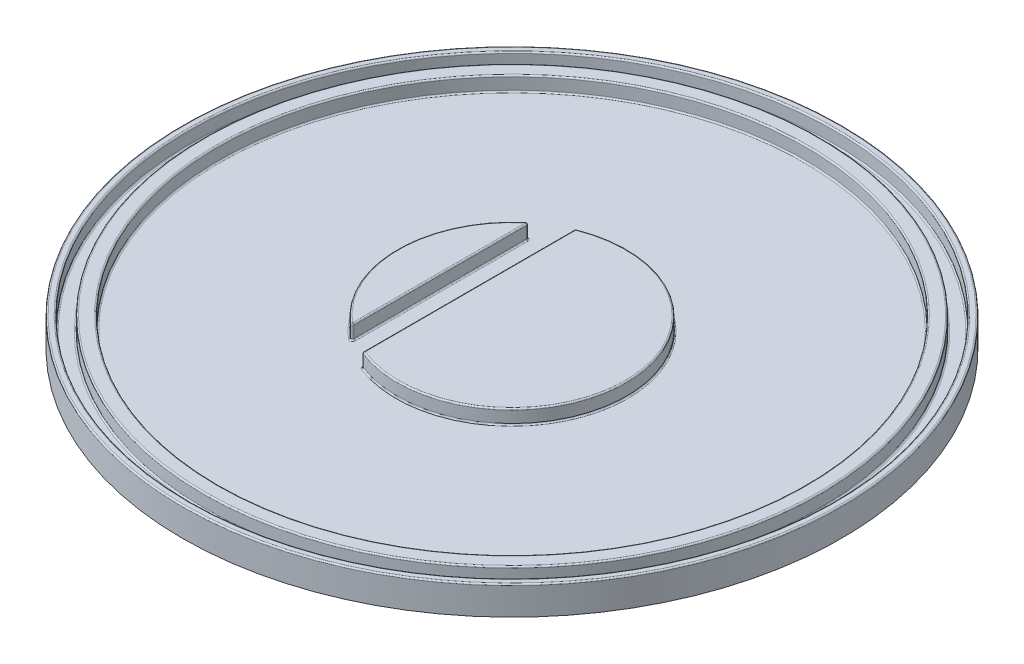
ISO-10303-21;
HEADER;
FILE_DESCRIPTION(('STEP AP214'),'2;1');
FILE_NAME('part.step','',(''),(''),'','','');
FILE_SCHEMA(('AUTOMOTIVE_DESIGN { 1 0 10303 214 1 1 1 1 }'));
ENDSEC;
DATA;
#1=APPLICATION_CONTEXT('core data for automotive mechanical design processes');
#2=APPLICATION_PROTOCOL_DEFINITION('international standard','automotive_design',2000,#1);
#3=PRODUCT_CONTEXT('',#1,'mechanical');
#4=PRODUCT('Part','Part','',(#3));
#5=PRODUCT_RELATED_PRODUCT_CATEGORY('part','',(#4));
#6=PRODUCT_DEFINITION_FORMATION('','',#4);
#7=PRODUCT_DEFINITION_CONTEXT('part definition',#1,'design');
#8=PRODUCT_DEFINITION('design','',#6,#7);
#9=PRODUCT_DEFINITION_SHAPE('','',#8);
#10=(LENGTH_UNIT() NAMED_UNIT(*) SI_UNIT(.MILLI.,.METRE.));
#11=(NAMED_UNIT(*) PLANE_ANGLE_UNIT() SI_UNIT($,.RADIAN.));
#12=(NAMED_UNIT(*) SI_UNIT($,.STERADIAN.) SOLID_ANGLE_UNIT());
#13=UNCERTAINTY_MEASURE_WITH_UNIT(LENGTH_MEASURE(1.E-05),#10,'distance_accuracy_value','');
#14=(GEOMETRIC_REPRESENTATION_CONTEXT(3) GLOBAL_UNCERTAINTY_ASSIGNED_CONTEXT((#13)) GLOBAL_UNIT_ASSIGNED_CONTEXT((#10,
#11,#12)) REPRESENTATION_CONTEXT('',''));
#15=CARTESIAN_POINT('',(0.,0.,0.));
#16=DIRECTION('',(0.,0.,1.));
#17=DIRECTION('',(1.,0.,0.));
#18=AXIS2_PLACEMENT_3D('',#15,#16,#17);
#19=CARTESIAN_POINT('',(0.,2.,0.));
#20=DIRECTION('',(0.,1.,0.));
#21=DIRECTION('',(0.,0.,1.));
#22=AXIS2_PLACEMENT_3D('',#19,#20,#21);
#23=PLANE('',#22);
#24=DIRECTION('',(0.,0.,-1.));
#25=VECTOR('',#24,1.);
#26=CARTESIAN_POINT('',(-2.9,2.,7.41619848709566));
#27=LINE('',#26,#25);
#28=CARTESIAN_POINT('',(-2.9,2.,-7.34846922834954));
#29=VERTEX_POINT('',#28);
#30=CARTESIAN_POINT('',(-2.9,2.,7.34846922834954));
#31=VERTEX_POINT('',#30);
#32=EDGE_CURVE('E211',#29,#31,#27,.F.);
#33=ORIENTED_EDGE('',*,*,#32,.T.);
#34=CARTESIAN_POINT('',(0.,2.,0.));
#35=DIRECTION('',(0.,1.,0.));
#36=DIRECTION('',(0.,0.,1.));
#37=AXIS2_PLACEMENT_3D('',#34,#35,#36);
#38=CIRCLE('',#37,7.9);
#39=EDGE_CURVE('E213',#31,#29,#38,.T.);
#40=ORIENTED_EDGE('',*,*,#39,.T.);
#41=EDGE_LOOP('',(#33,#40));
#42=FACE_BOUND('',#41,.T.);
#43=ADVANCED_FACE('F40',(#42),#23,.T.);
#44=CARTESIAN_POINT('',(0.,2.,0.));
#45=DIRECTION('',(0.,-1.,0.));
#46=DIRECTION('',(0.,0.,-1.));
#47=AXIS2_PLACEMENT_3D('',#44,#45,#46);
#48=CYLINDRICAL_SURFACE('',#47,8.);
#49=DIRECTION('',(0.,-1.,0.));
#50=VECTOR('',#49,1.);
#51=CARTESIAN_POINT('',(-2.93670886075949,2.,-7.44148782617675));
#52=LINE('',#51,#50);
#53=CARTESIAN_POINT('',(-2.93670886075949,1.1,-7.44148782617674));
#54=VERTEX_POINT('',#53);
#55=CARTESIAN_POINT('',(-2.93670886075949,1.9,-7.44148782617674));
#56=VERTEX_POINT('',#55);
#57=EDGE_CURVE('E154',#54,#56,#52,.F.);
#58=ORIENTED_EDGE('',*,*,#57,.T.);
#59=CARTESIAN_POINT('',(0.,1.9,0.));
#60=DIRECTION('',(0.,1.,0.));
#61=DIRECTION('',(0.,0.,1.));
#62=AXIS2_PLACEMENT_3D('',#59,#60,#61);
#63=CIRCLE('',#62,8.);
#64=CARTESIAN_POINT('',(-2.93670886075949,1.9,7.44148782617674));
#65=VERTEX_POINT('',#64);
#66=EDGE_CURVE('E150',#56,#65,#63,.F.);
#67=ORIENTED_EDGE('',*,*,#66,.T.);
#68=DIRECTION('',(0.,-1.,0.));
#69=VECTOR('',#68,1.);
#70=CARTESIAN_POINT('',(-2.93670886075949,2.,7.44148782617675));
#71=LINE('',#70,#69);
#72=CARTESIAN_POINT('',(-2.93670886075949,1.1,7.44148782617674));
#73=VERTEX_POINT('',#72);
#74=EDGE_CURVE('E143',#65,#73,#71,.T.);
#75=ORIENTED_EDGE('',*,*,#74,.T.);
#76=CARTESIAN_POINT('',(0.,1.1,0.));
#77=DIRECTION('',(0.,1.,0.));
#78=DIRECTION('',(0.,0.,1.));
#79=AXIS2_PLACEMENT_3D('',#76,#77,#78);
#80=CIRCLE('',#79,8.);
#81=EDGE_CURVE('E147',#73,#54,#80,.T.);
#82=ORIENTED_EDGE('',*,*,#81,.T.);
#83=EDGE_LOOP('',(#58,#67,#75,#82));
#84=FACE_BOUND('',#83,.T.);
#85=ADVANCED_FACE('F146',(#84),#48,.T.);
#86=CARTESIAN_POINT('',(0.,1.,0.));
#87=DIRECTION('',(0.,-1.,0.));
#88=DIRECTION('',(0.,0.,-1.));
#89=AXIS2_PLACEMENT_3D('',#86,#87,#88);
#90=CYLINDRICAL_SURFACE('',#89,23.);
#91=CARTESIAN_POINT('',(0.,1.9,0.));
#92=DIRECTION('',(0.,1.,0.));
#93=DIRECTION('',(0.,0.,1.));
#94=AXIS2_PLACEMENT_3D('',#91,#92,#93);
#95=CIRCLE('',#94,23.);
#96=CARTESIAN_POINT('',(0.,1.9,23.));
#97=VERTEX_POINT('',#96);
#98=EDGE_CURVE('E268',#97,#97,#95,.F.);
#99=ORIENTED_EDGE('',*,*,#98,.T.);
#100=EDGE_LOOP('',(#99));
#101=FACE_BOUND('',#100,.T.);
#102=CARTESIAN_POINT('',(0.,0.,0.));
#103=DIRECTION('',(0.,1.,0.));
#104=DIRECTION('',(0.,0.,1.));
#105=AXIS2_PLACEMENT_3D('',#102,#103,#104);
#106=CIRCLE('',#105,23.);
#107=CARTESIAN_POINT('',(0.,0.,23.));
#108=VERTEX_POINT('',#107);
#109=EDGE_CURVE('E163',#108,#108,#106,.T.);
#110=ORIENTED_EDGE('',*,*,#109,.T.);
#111=EDGE_LOOP('',(#110));
#112=FACE_BOUND('',#111,.T.);
#113=ADVANCED_FACE('F389',(#101,#112),#90,.T.);
#114=CARTESIAN_POINT('',(0.,0.,0.));
#115=DIRECTION('',(0.,1.,0.));
#116=DIRECTION('',(0.,0.,1.));
#117=AXIS2_PLACEMENT_3D('',#114,#115,#116);
#118=PLANE('',#117);
#119=ORIENTED_EDGE('',*,*,#109,.F.);
#120=EDGE_LOOP('',(#119));
#121=FACE_BOUND('',#120,.T.);
#122=ADVANCED_FACE('F506',(#121),#118,.F.);
#123=CARTESIAN_POINT('',(0.,2.,0.));
#124=DIRECTION('',(0.,1.,0.));
#125=DIRECTION('',(0.,0.,1.));
#126=AXIS2_PLACEMENT_3D('',#123,#124,#125);
#127=PLANE('',#126);
#128=CARTESIAN_POINT('',(0.,2.,0.));
#129=DIRECTION('',(0.,1.,0.));
#130=DIRECTION('',(0.,0.,1.));
#131=AXIS2_PLACEMENT_3D('',#128,#129,#130);
#132=CIRCLE('',#131,22.6);
#133=CARTESIAN_POINT('',(0.,2.,22.6));
#134=VERTEX_POINT('',#133);
#135=EDGE_CURVE('E265',#134,#134,#132,.F.);
#136=ORIENTED_EDGE('',*,*,#135,.T.);
#137=EDGE_LOOP('',(#136));
#138=FACE_BOUND('',#137,.T.);
#139=CARTESIAN_POINT('',(0.,2.,0.));
#140=DIRECTION('',(0.,1.,0.));
#141=DIRECTION('',(0.,0.,1.));
#142=AXIS2_PLACEMENT_3D('',#139,#140,#141);
#143=CIRCLE('',#142,22.9);
#144=CARTESIAN_POINT('',(0.,2.,22.9));
#145=VERTEX_POINT('',#144);
#146=EDGE_CURVE('E262',#145,#145,#143,.T.);
#147=ORIENTED_EDGE('',*,*,#146,.T.);
#148=EDGE_LOOP('',(#147));
#149=FACE_BOUND('',#148,.T.);
#150=ADVANCED_FACE('F496',(#138,#149),#127,.T.);
#151=CARTESIAN_POINT('',(0.,2.,0.));
#152=DIRECTION('',(0.,-1.,0.));
#153=DIRECTION('',(0.,0.,-1.));
#154=AXIS2_PLACEMENT_3D('',#151,#152,#153);
#155=CYLINDRICAL_SURFACE('',#154,22.5);
#156=CARTESIAN_POINT('',(0.,1.1,0.));
#157=DIRECTION('',(0.,1.,0.));
#158=DIRECTION('',(0.,0.,1.));
#159=AXIS2_PLACEMENT_3D('',#156,#157,#158);
#160=CIRCLE('',#159,22.5);
#161=CARTESIAN_POINT('',(0.,1.1,22.5));
#162=VERTEX_POINT('',#161);
#163=EDGE_CURVE('E253',#162,#162,#160,.F.);
#164=ORIENTED_EDGE('',*,*,#163,.T.);
#165=EDGE_LOOP('',(#164));
#166=FACE_BOUND('',#165,.T.);
#167=CARTESIAN_POINT('',(0.,1.9,0.));
#168=DIRECTION('',(0.,1.,0.));
#169=DIRECTION('',(0.,0.,1.));
#170=AXIS2_PLACEMENT_3D('',#167,#168,#169);
#171=CIRCLE('',#170,22.5);
#172=CARTESIAN_POINT('',(0.,1.9,22.5));
#173=VERTEX_POINT('',#172);
#174=EDGE_CURVE('E250',#173,#173,#171,.T.);
#175=ORIENTED_EDGE('',*,*,#174,.T.);
#176=EDGE_LOOP('',(#175));
#177=FACE_BOUND('',#176,.T.);
#178=ADVANCED_FACE('F493',(#166,#177),#155,.F.);
#179=CARTESIAN_POINT('',(0.,1.,0.));
#180=DIRECTION('',(0.,1.,0.));
#181=DIRECTION('',(0.,0.,1.));
#182=AXIS2_PLACEMENT_3D('',#179,#180,#181);
#183=PLANE('',#182);
#184=CARTESIAN_POINT('',(0.,1.,0.));
#185=DIRECTION('',(0.,1.,0.));
#186=DIRECTION('',(0.,0.,1.));
#187=AXIS2_PLACEMENT_3D('',#184,#185,#186);
#188=CIRCLE('',#187,22.4);
#189=CARTESIAN_POINT('',(0.,1.,22.4));
#190=VERTEX_POINT('',#189);
#191=EDGE_CURVE('E259',#190,#190,#188,.T.);
#192=ORIENTED_EDGE('',*,*,#191,.T.);
#193=EDGE_LOOP('',(#192));
#194=FACE_BOUND('',#193,.T.);
#195=CARTESIAN_POINT('',(0.,1.,0.));
#196=DIRECTION('',(0.,1.,0.));
#197=DIRECTION('',(0.,0.,1.));
#198=AXIS2_PLACEMENT_3D('',#195,#196,#197);
#199=CIRCLE('',#198,21.6);
#200=CARTESIAN_POINT('',(0.,1.,21.6));
#201=VERTEX_POINT('',#200);
#202=EDGE_CURVE('E256',#201,#201,#199,.F.);
#203=ORIENTED_EDGE('',*,*,#202,.T.);
#204=EDGE_LOOP('',(#203));
#205=FACE_BOUND('',#204,.T.);
#206=ADVANCED_FACE('F495',(#194,#205),#183,.T.);
#207=CARTESIAN_POINT('',(0.,2.,0.));
#208=DIRECTION('',(0.,-1.,0.));
#209=DIRECTION('',(0.,0.,-1.));
#210=AXIS2_PLACEMENT_3D('',#207,#208,#209);
#211=CYLINDRICAL_SURFACE('',#210,20.5);
#212=CARTESIAN_POINT('',(0.,1.1,0.));
#213=DIRECTION('',(0.,1.,0.));
#214=DIRECTION('',(0.,0.,1.));
#215=AXIS2_PLACEMENT_3D('',#212,#213,#214);
#216=CIRCLE('',#215,20.5);
#217=CARTESIAN_POINT('',(0.,1.1,20.5));
#218=VERTEX_POINT('',#217);
#219=EDGE_CURVE('E219',#218,#218,#216,.F.);
#220=ORIENTED_EDGE('',*,*,#219,.T.);
#221=EDGE_LOOP('',(#220));
#222=FACE_BOUND('',#221,.T.);
#223=CARTESIAN_POINT('',(0.,1.9,0.));
#224=DIRECTION('',(0.,1.,0.));
#225=DIRECTION('',(0.,0.,1.));
#226=AXIS2_PLACEMENT_3D('',#223,#224,#225);
#227=CIRCLE('',#226,20.5);
#228=CARTESIAN_POINT('',(0.,1.9,20.5));
#229=VERTEX_POINT('',#228);
#230=EDGE_CURVE('E216',#229,#229,#227,.T.);
#231=ORIENTED_EDGE('',*,*,#230,.T.);
#232=EDGE_LOOP('',(#231));
#233=FACE_BOUND('',#232,.T.);
#234=ADVANCED_FACE('F503',(#222,#233),#211,.F.);
#235=CARTESIAN_POINT('',(0.,2.,0.));
#236=DIRECTION('',(0.,-1.,0.));
#237=DIRECTION('',(0.,0.,-1.));
#238=AXIS2_PLACEMENT_3D('',#235,#236,#237);
#239=CYLINDRICAL_SURFACE('',#238,21.5);
#240=CARTESIAN_POINT('',(0.,1.9,0.));
#241=DIRECTION('',(0.,1.,0.));
#242=DIRECTION('',(0.,0.,1.));
#243=AXIS2_PLACEMENT_3D('',#240,#241,#242);
#244=CIRCLE('',#243,21.5);
#245=CARTESIAN_POINT('',(0.,1.9,21.5));
#246=VERTEX_POINT('',#245);
#247=EDGE_CURVE('E247',#246,#246,#244,.F.);
#248=ORIENTED_EDGE('',*,*,#247,.T.);
#249=EDGE_LOOP('',(#248));
#250=FACE_BOUND('',#249,.T.);
#251=CARTESIAN_POINT('',(0.,1.1,0.));
#252=DIRECTION('',(0.,1.,0.));
#253=DIRECTION('',(0.,0.,1.));
#254=AXIS2_PLACEMENT_3D('',#251,#252,#253);
#255=CIRCLE('',#254,21.5);
#256=CARTESIAN_POINT('',(0.,1.1,21.5));
#257=VERTEX_POINT('',#256);
#258=EDGE_CURVE('E244',#257,#257,#255,.T.);
#259=ORIENTED_EDGE('',*,*,#258,.T.);
#260=EDGE_LOOP('',(#259));
#261=FACE_BOUND('',#260,.T.);
#262=ADVANCED_FACE('F380',(#250,#261),#239,.T.);
#263=CARTESIAN_POINT('',(0.,2.,0.));
#264=DIRECTION('',(0.,1.,0.));
#265=DIRECTION('',(0.,0.,1.));
#266=AXIS2_PLACEMENT_3D('',#263,#264,#265);
#267=PLANE('',#266);
#268=CARTESIAN_POINT('',(0.,2.,0.));
#269=DIRECTION('',(0.,1.,0.));
#270=DIRECTION('',(0.,0.,1.));
#271=AXIS2_PLACEMENT_3D('',#268,#269,#270);
#272=CIRCLE('',#271,21.4);
#273=CARTESIAN_POINT('',(0.,2.,21.4));
#274=VERTEX_POINT('',#273);
#275=EDGE_CURVE('E241',#274,#274,#272,.T.);
#276=ORIENTED_EDGE('',*,*,#275,.T.);
#277=EDGE_LOOP('',(#276));
#278=FACE_BOUND('',#277,.T.);
#279=CARTESIAN_POINT('',(0.,2.,0.));
#280=DIRECTION('',(0.,1.,0.));
#281=DIRECTION('',(0.,0.,1.));
#282=AXIS2_PLACEMENT_3D('',#279,#280,#281);
#283=CIRCLE('',#282,20.6);
#284=CARTESIAN_POINT('',(0.,2.,20.6));
#285=VERTEX_POINT('',#284);
#286=EDGE_CURVE('E238',#285,#285,#283,.F.);
#287=ORIENTED_EDGE('',*,*,#286,.T.);
#288=EDGE_LOOP('',(#287));
#289=FACE_BOUND('',#288,.T.);
#290=ADVANCED_FACE('F373',(#278,#289),#267,.T.);
#291=DIRECTION('',(0.,0.,1.));
#292=VECTOR('',#291,1.);
#293=CARTESIAN_POINT('',(-5.1,2.,-6.2449979983984));
#294=LINE('',#293,#292);
#295=CARTESIAN_POINT('',(-5.1,2.,6.03324125159935));
#296=VERTEX_POINT('',#295);
#297=CARTESIAN_POINT('',(-5.1,2.,-6.03324125159935));
#298=VERTEX_POINT('',#297);
#299=EDGE_CURVE('E206',#296,#298,#294,.F.);
#300=ORIENTED_EDGE('',*,*,#299,.T.);
#301=CARTESIAN_POINT('',(0.,2.,0.));
#302=DIRECTION('',(0.,1.,0.));
#303=DIRECTION('',(0.,0.,1.));
#304=AXIS2_PLACEMENT_3D('',#301,#302,#303);
#305=CIRCLE('',#304,7.9);
#306=EDGE_CURVE('E208',#298,#296,#305,.T.);
#307=ORIENTED_EDGE('',*,*,#306,.T.);
#308=EDGE_LOOP('',(#300,#307));
#309=FACE_BOUND('',#308,.T.);
#310=ADVANCED_FACE('F371',(#309),#23,.T.);
#311=DIRECTION('',(0.,-1.,0.));
#312=VECTOR('',#311,1.);
#313=CARTESIAN_POINT('',(-5.16455696202532,2.,6.10961139402465));
#314=LINE('',#313,#312);
#315=CARTESIAN_POINT('',(-5.16455696202532,1.1,6.10961139402465));
#316=VERTEX_POINT('',#315);
#317=CARTESIAN_POINT('',(-5.16455696202532,1.9,6.10961139402465));
#318=VERTEX_POINT('',#317);
#319=EDGE_CURVE('E192',#316,#318,#314,.F.);
#320=ORIENTED_EDGE('',*,*,#319,.T.);
#321=CARTESIAN_POINT('',(0.,1.9,0.));
#322=DIRECTION('',(0.,1.,0.));
#323=DIRECTION('',(0.,0.,1.));
#324=AXIS2_PLACEMENT_3D('',#321,#322,#323);
#325=CIRCLE('',#324,8.);
#326=CARTESIAN_POINT('',(-5.16455696202532,1.9,-6.10961139402465));
#327=VERTEX_POINT('',#326);
#328=EDGE_CURVE('E195',#318,#327,#325,.F.);
#329=ORIENTED_EDGE('',*,*,#328,.T.);
#330=DIRECTION('',(0.,-1.,0.));
#331=VECTOR('',#330,1.);
#332=CARTESIAN_POINT('',(-5.16455696202532,2.,-6.10961139402465));
#333=LINE('',#332,#331);
#334=CARTESIAN_POINT('',(-5.16455696202532,1.1,-6.10961139402465));
#335=VERTEX_POINT('',#334);
#336=EDGE_CURVE('E190',#327,#335,#333,.T.);
#337=ORIENTED_EDGE('',*,*,#336,.T.);
#338=CARTESIAN_POINT('',(0.,1.1,0.));
#339=DIRECTION('',(0.,1.,0.));
#340=DIRECTION('',(0.,0.,1.));
#341=AXIS2_PLACEMENT_3D('',#338,#339,#340);
#342=CIRCLE('',#341,8.);
#343=EDGE_CURVE('E188',#335,#316,#342,.T.);
#344=ORIENTED_EDGE('',*,*,#343,.T.);
#345=EDGE_LOOP('',(#320,#329,#337,#344));
#346=FACE_BOUND('',#345,.T.);
#347=ADVANCED_FACE('F348',(#346),#48,.T.);
#348=CARTESIAN_POINT('',(0.,1.,0.));
#349=DIRECTION('',(0.,1.,0.));
#350=DIRECTION('',(0.,0.,1.));
#351=AXIS2_PLACEMENT_3D('',#348,#349,#350);
#352=CIRCLE('',#351,20.4);
#353=CARTESIAN_POINT('',(0.,1.,20.4));
#354=VERTEX_POINT('',#353);
#355=EDGE_CURVE('E235',#354,#354,#352,.T.);
#356=ORIENTED_EDGE('',*,*,#355,.T.);
#357=EDGE_LOOP('',(#356));
#358=FACE_BOUND('',#357,.T.);
#359=CARTESIAN_POINT('',(-2.9,1.,-7.34846922834954));
#360=DIRECTION('',(0.,1.,0.));
#361=DIRECTION('',(0.,0.,1.));
#362=AXIS2_PLACEMENT_3D('',#359,#360,#361);
#363=CIRCLE('',#362,0.2);
#364=CARTESIAN_POINT('',(-2.97341772151899,1.,-7.53450642400395));
#365=VERTEX_POINT('',#364);
#366=CARTESIAN_POINT('',(-3.1,1.,-7.34846922834954));
#367=VERTEX_POINT('',#366);
#368=EDGE_CURVE('E227',#365,#367,#363,.T.);
#369=ORIENTED_EDGE('',*,*,#368,.F.);
#370=CARTESIAN_POINT('',(0.,1.,0.));
#371=DIRECTION('',(0.,1.,0.));
#372=DIRECTION('',(0.,0.,1.));
#373=AXIS2_PLACEMENT_3D('',#370,#371,#372);
#374=CIRCLE('',#373,8.1);
#375=CARTESIAN_POINT('',(-2.97341772151899,1.,7.53450642400395));
#376=VERTEX_POINT('',#375);
#377=EDGE_CURVE('E233',#365,#376,#374,.F.);
#378=ORIENTED_EDGE('',*,*,#377,.T.);
#379=CARTESIAN_POINT('',(-2.9,1.,7.34846922834954));
#380=DIRECTION('',(0.,1.,0.));
#381=DIRECTION('',(0.,0.,1.));
#382=AXIS2_PLACEMENT_3D('',#379,#380,#381);
#383=CIRCLE('',#382,0.2);
#384=CARTESIAN_POINT('',(-3.1,1.,7.34846922834954));
#385=VERTEX_POINT('',#384);
#386=EDGE_CURVE('E64',#385,#376,#383,.T.);
#387=ORIENTED_EDGE('',*,*,#386,.F.);
#388=DIRECTION('',(0.,0.,1.));
#389=VECTOR('',#388,1.);
#390=CARTESIAN_POINT('',(-3.1,1.,0.));
#391=LINE('',#390,#389);
#392=EDGE_CURVE('E230',#385,#367,#391,.F.);
#393=ORIENTED_EDGE('',*,*,#392,.T.);
#394=EDGE_LOOP('',(#369,#378,#387,#393));
#395=FACE_BOUND('',#394,.T.);
#396=CARTESIAN_POINT('',(0.,1.,0.));
#397=DIRECTION('',(0.,1.,0.));
#398=DIRECTION('',(0.,0.,1.));
#399=AXIS2_PLACEMENT_3D('',#396,#397,#398);
#400=CIRCLE('',#399,8.1);
#401=CARTESIAN_POINT('',(-5.22911392405063,1.,6.18598153644996));
#402=VERTEX_POINT('',#401);
#403=CARTESIAN_POINT('',(-5.22911392405063,1.,-6.18598153644996));
#404=VERTEX_POINT('',#403);
#405=EDGE_CURVE('E222',#402,#404,#400,.F.);
#406=ORIENTED_EDGE('',*,*,#405,.T.);
#407=CARTESIAN_POINT('',(-5.1,1.,-6.03324125159934));
#408=DIRECTION('',(0.,1.,0.));
#409=DIRECTION('',(0.,0.,1.));
#410=AXIS2_PLACEMENT_3D('',#407,#408,#409);
#411=CIRCLE('',#410,0.2);
#412=CARTESIAN_POINT('',(-4.9,1.,-6.03324125159934));
#413=VERTEX_POINT('',#412);
#414=EDGE_CURVE('E12',#404,#413,#411,.F.);
#415=ORIENTED_EDGE('',*,*,#414,.T.);
#416=DIRECTION('',(0.,0.,-1.));
#417=VECTOR('',#416,1.);
#418=CARTESIAN_POINT('',(-4.9,1.,0.));
#419=LINE('',#418,#417);
#420=CARTESIAN_POINT('',(-4.9,1.,6.03324125159934));
#421=VERTEX_POINT('',#420);
#422=EDGE_CURVE('E224',#413,#421,#419,.F.);
#423=ORIENTED_EDGE('',*,*,#422,.T.);
#424=CARTESIAN_POINT('',(-5.1,1.,6.03324125159934));
#425=DIRECTION('',(0.,1.,0.));
#426=DIRECTION('',(0.,0.,1.));
#427=AXIS2_PLACEMENT_3D('',#424,#425,#426);
#428=CIRCLE('',#427,0.2);
#429=EDGE_CURVE('E49',#421,#402,#428,.F.);
#430=ORIENTED_EDGE('',*,*,#429,.T.);
#431=EDGE_LOOP('',(#406,#415,#423,#430));
#432=FACE_BOUND('',#431,.T.);
#433=ADVANCED_FACE('F341',(#358,#395,#432),#183,.T.);
#434=CARTESIAN_POINT('',(-3.,-13.9666295470958,-7.41619848709566));
#435=DIRECTION('',(1.,0.,0.));
#436=DIRECTION('',(0.,0.,-1.));
#437=AXIS2_PLACEMENT_3D('',#434,#435,#436);
#438=PLANE('',#437);
#439=DIRECTION('',(0.,-1.,0.));
#440=VECTOR('',#439,1.);
#441=CARTESIAN_POINT('',(-3.,-13.9666295470958,7.34846922834953));
#442=LINE('',#441,#440);
#443=CARTESIAN_POINT('',(-3.,1.1,7.34846922834954));
#444=VERTEX_POINT('',#443);
#445=CARTESIAN_POINT('',(-3.,1.9,7.34846922834954));
#446=VERTEX_POINT('',#445);
#447=EDGE_CURVE('E160',#444,#446,#442,.F.);
#448=ORIENTED_EDGE('',*,*,#447,.T.);
#449=DIRECTION('',(0.,0.,-1.));
#450=VECTOR('',#449,1.);
#451=CARTESIAN_POINT('',(-3.,1.9,-7.41619848709566));
#452=LINE('',#451,#450);
#453=CARTESIAN_POINT('',(-3.,1.9,-7.34846922834954));
#454=VERTEX_POINT('',#453);
#455=EDGE_CURVE('E186',#446,#454,#452,.T.);
#456=ORIENTED_EDGE('',*,*,#455,.T.);
#457=DIRECTION('',(0.,-1.,0.));
#458=VECTOR('',#457,1.);
#459=CARTESIAN_POINT('',(-3.,-13.9666295470958,-7.34846922834954));
#460=LINE('',#459,#458);
#461=CARTESIAN_POINT('',(-3.,1.1,-7.34846922834954));
#462=VERTEX_POINT('',#461);
#463=EDGE_CURVE('E183',#454,#462,#460,.T.);
#464=ORIENTED_EDGE('',*,*,#463,.T.);
#465=DIRECTION('',(0.,0.,1.));
#466=VECTOR('',#465,1.);
#467=CARTESIAN_POINT('',(-3.,1.1,-7.41619848709566));
#468=LINE('',#467,#466);
#469=EDGE_CURVE('E180',#462,#444,#468,.T.);
#470=ORIENTED_EDGE('',*,*,#469,.T.);
#471=EDGE_LOOP('',(#448,#456,#464,#470));
#472=FACE_BOUND('',#471,.T.);
#473=ADVANCED_FACE('F411',(#472),#438,.F.);
#474=CARTESIAN_POINT('',(-5.,-13.9666295470958,-6.2449979983984));
#475=DIRECTION('',(-1.,0.,0.));
#476=DIRECTION('',(0.,0.,1.));
#477=AXIS2_PLACEMENT_3D('',#474,#475,#476);
#478=PLANE('',#477);
#479=DIRECTION('',(0.,-1.,0.));
#480=VECTOR('',#479,1.);
#481=CARTESIAN_POINT('',(-5.,-13.9666295470958,-6.03324125159934));
#482=LINE('',#481,#480);
#483=CARTESIAN_POINT('',(-5.,1.1,-6.03324125159934));
#484=VERTEX_POINT('',#483);
#485=CARTESIAN_POINT('',(-5.,1.9,-6.03324125159934));
#486=VERTEX_POINT('',#485);
#487=EDGE_CURVE('E199',#484,#486,#482,.F.);
#488=ORIENTED_EDGE('',*,*,#487,.T.);
#489=DIRECTION('',(0.,0.,1.));
#490=VECTOR('',#489,1.);
#491=CARTESIAN_POINT('',(-5.,1.9,6.2449979983984));
#492=LINE('',#491,#490);
#493=CARTESIAN_POINT('',(-5.,1.9,6.03324125159934));
#494=VERTEX_POINT('',#493);
#495=EDGE_CURVE('E204',#486,#494,#492,.T.);
#496=ORIENTED_EDGE('',*,*,#495,.T.);
#497=DIRECTION('',(0.,-1.,0.));
#498=VECTOR('',#497,1.);
#499=CARTESIAN_POINT('',(-5.,-13.9666295470958,6.03324125159934));
#500=LINE('',#499,#498);
#501=CARTESIAN_POINT('',(-5.,1.1,6.03324125159934));
#502=VERTEX_POINT('',#501);
#503=EDGE_CURVE('E201',#494,#502,#500,.T.);
#504=ORIENTED_EDGE('',*,*,#503,.T.);
#505=DIRECTION('',(0.,0.,-1.));
#506=VECTOR('',#505,1.);
#507=CARTESIAN_POINT('',(-5.,1.1,-6.2449979983984));
#508=LINE('',#507,#506);
#509=EDGE_CURVE('E197',#502,#484,#508,.T.);
#510=ORIENTED_EDGE('',*,*,#509,.T.);
#511=EDGE_LOOP('',(#488,#496,#504,#510));
#512=FACE_BOUND('',#511,.T.);
#513=ADVANCED_FACE('F361',(#512),#478,.F.);
#514=CARTESIAN_POINT('',(-2.9,2.,7.34846922834954));
#515=DIRECTION('',(0.,-1.,0.));
#516=DIRECTION('',(0.,0.,-1.));
#517=AXIS2_PLACEMENT_3D('',#514,#515,#516);
#518=CYLINDRICAL_SURFACE('',#517,0.1);
#519=CARTESIAN_POINT('',(-2.9,1.1,7.34846922834954));
#520=DIRECTION('',(0.,1.,0.));
#521=DIRECTION('',(0.,0.,1.));
#522=AXIS2_PLACEMENT_3D('',#519,#520,#521);
#523=CIRCLE('',#522,0.1);
#524=EDGE_CURVE('E158',#73,#444,#523,.F.);
#525=ORIENTED_EDGE('',*,*,#524,.F.);
#526=ORIENTED_EDGE('',*,*,#74,.F.);
#527=CARTESIAN_POINT('',(-2.9,1.9,7.34846922834954));
#528=DIRECTION('',(0.,1.,0.));
#529=DIRECTION('',(0.,0.,1.));
#530=AXIS2_PLACEMENT_3D('',#527,#528,#529);
#531=CIRCLE('',#530,0.1);
#532=EDGE_CURVE('E164',#446,#65,#531,.T.);
#533=ORIENTED_EDGE('',*,*,#532,.F.);
#534=ORIENTED_EDGE('',*,*,#447,.F.);
#535=EDGE_LOOP('',(#525,#526,#533,#534));
#536=FACE_BOUND('',#535,.T.);
#537=ADVANCED_FACE('F159',(#536),#518,.T.);
#538=CARTESIAN_POINT('',(-2.9,1.1,7.34846922834954));
#539=DIRECTION('',(0.,1.,0.));
#540=DIRECTION('',(0.,0.,1.));
#541=AXIS2_PLACEMENT_3D('',#538,#539,#540);
#542=TOROIDAL_SURFACE('',#541,0.2,0.1);
#543=CARTESIAN_POINT('',(-2.97341772151899,1.1,7.53450642400395));
#544=DIRECTION('',(0.930185978272093,0.,0.367088607594936));
#545=DIRECTION('',(0.367088607594936,0.,-0.930185978272093));
#546=AXIS2_PLACEMENT_3D('',#543,#544,#545);
#547=CIRCLE('',#546,0.1);
#548=EDGE_CURVE('E57',#73,#376,#547,.F.);
#549=ORIENTED_EDGE('',*,*,#548,.F.);
#550=ORIENTED_EDGE('',*,*,#524,.T.);
#551=CARTESIAN_POINT('',(-3.1,1.1,7.34846922834954));
#552=DIRECTION('',(0.,0.,-1.));
#553=DIRECTION('',(-1.,0.,0.));
#554=AXIS2_PLACEMENT_3D('',#551,#552,#553);
#555=CIRCLE('',#554,0.1);
#556=EDGE_CURVE('E167',#385,#444,#555,.F.);
#557=ORIENTED_EDGE('',*,*,#556,.F.);
#558=ORIENTED_EDGE('',*,*,#386,.T.);
#559=EDGE_LOOP('',(#549,#550,#557,#558));
#560=FACE_BOUND('',#559,.T.);
#561=ADVANCED_FACE('F166',(#560),#542,.F.);
#562=CARTESIAN_POINT('',(-2.9,1.9,7.34846922834954));
#563=DIRECTION('',(0.,0.,1.));
#564=DIRECTION('',(1.,0.,0.));
#565=AXIS2_PLACEMENT_3D('',#562,#563,#564);
#566=SPHERICAL_SURFACE('',#565,0.1);
#567=CARTESIAN_POINT('',(-2.9,1.9,7.34846922834954));
#568=DIRECTION('',(0.,0.,1.));
#569=DIRECTION('',(1.,0.,0.));
#570=AXIS2_PLACEMENT_3D('',#567,#568,#569);
#571=CIRCLE('',#570,0.1);
#572=EDGE_CURVE('E285',#446,#31,#571,.F.);
#573=ORIENTED_EDGE('',*,*,#572,.F.);
#574=ORIENTED_EDGE('',*,*,#532,.T.);
#575=CARTESIAN_POINT('',(-2.9,1.9,7.34846922834954));
#576=DIRECTION('',(-0.930185978272093,0.,-0.367088607594936));
#577=DIRECTION('',(-0.367088607594936,0.,0.930185978272093));
#578=AXIS2_PLACEMENT_3D('',#575,#576,#577);
#579=CIRCLE('',#578,0.1);
#580=EDGE_CURVE('E168',#31,#65,#579,.F.);
#581=ORIENTED_EDGE('',*,*,#580,.F.);
#582=EDGE_LOOP('',(#573,#574,#581));
#583=FACE_BOUND('',#582,.T.);
#584=ADVANCED_FACE('F399',(#583),#566,.T.);
#585=CARTESIAN_POINT('',(-3.1,1.1,-7.41619848709566));
#586=DIRECTION('',(0.,0.,1.));
#587=DIRECTION('',(1.,0.,0.));
#588=AXIS2_PLACEMENT_3D('',#585,#586,#587);
#589=CYLINDRICAL_SURFACE('',#588,0.1);
#590=ORIENTED_EDGE('',*,*,#556,.T.);
#591=ORIENTED_EDGE('',*,*,#469,.F.);
#592=CARTESIAN_POINT('',(-3.1,1.1,-7.34846922834954));
#593=DIRECTION('',(0.,0.,1.));
#594=DIRECTION('',(1.,0.,0.));
#595=AXIS2_PLACEMENT_3D('',#592,#593,#594);
#596=CIRCLE('',#595,0.1);
#597=EDGE_CURVE('E282',#367,#462,#596,.T.);
#598=ORIENTED_EDGE('',*,*,#597,.F.);
#599=ORIENTED_EDGE('',*,*,#392,.F.);
#600=EDGE_LOOP('',(#590,#591,#598,#599));
#601=FACE_BOUND('',#600,.T.);
#602=ADVANCED_FACE('F415',(#601),#589,.F.);
#603=CARTESIAN_POINT('',(0.,1.1,0.));
#604=DIRECTION('',(0.,1.,0.));
#605=DIRECTION('',(0.,0.,1.));
#606=AXIS2_PLACEMENT_3D('',#603,#604,#605);
#607=TOROIDAL_SURFACE('',#606,8.1,0.1);
#608=ORIENTED_EDGE('',*,*,#548,.T.);
#609=ORIENTED_EDGE('',*,*,#377,.F.);
#610=CARTESIAN_POINT('',(-2.97341772151899,1.1,-7.53450642400395));
#611=DIRECTION('',(0.930185978272093,0.,-0.367088607594936));
#612=DIRECTION('',(-0.367088607594936,0.,-0.930185978272093));
#613=AXIS2_PLACEMENT_3D('',#610,#611,#612);
#614=CIRCLE('',#613,0.1);
#615=EDGE_CURVE('E172',#54,#365,#614,.T.);
#616=ORIENTED_EDGE('',*,*,#615,.F.);
#617=ORIENTED_EDGE('',*,*,#81,.F.);
#618=EDGE_LOOP('',(#608,#609,#616,#617));
#619=FACE_BOUND('',#618,.T.);
#620=ADVANCED_FACE('F170',(#619),#607,.F.);
#621=CARTESIAN_POINT('',(0.,1.9,0.));
#622=DIRECTION('',(0.,1.,0.));
#623=DIRECTION('',(0.,0.,1.));
#624=AXIS2_PLACEMENT_3D('',#621,#622,#623);
#625=TOROIDAL_SURFACE('',#624,7.9,0.1);
#626=ORIENTED_EDGE('',*,*,#580,.T.);
#627=ORIENTED_EDGE('',*,*,#66,.F.);
#628=CARTESIAN_POINT('',(-2.9,1.9,-7.34846922834954));
#629=DIRECTION('',(-0.930185978272093,0.,0.367088607594935));
#630=DIRECTION('',(0.367088607594936,0.,0.930185978272094));
#631=AXIS2_PLACEMENT_3D('',#628,#629,#630);
#632=CIRCLE('',#631,0.1);
#633=EDGE_CURVE('E278',#29,#56,#632,.T.);
#634=ORIENTED_EDGE('',*,*,#633,.F.);
#635=ORIENTED_EDGE('',*,*,#39,.F.);
#636=EDGE_LOOP('',(#626,#627,#634,#635));
#637=FACE_BOUND('',#636,.T.);
#638=ADVANCED_FACE('F402',(#637),#625,.T.);
#639=CARTESIAN_POINT('',(-2.9,1.9,-7.41619848709566));
#640=DIRECTION('',(0.,0.,1.));
#641=DIRECTION('',(1.,0.,0.));
#642=AXIS2_PLACEMENT_3D('',#639,#640,#641);
#643=CYLINDRICAL_SURFACE('',#642,0.1);
#644=ORIENTED_EDGE('',*,*,#572,.T.);
#645=ORIENTED_EDGE('',*,*,#32,.F.);
#646=CARTESIAN_POINT('',(-2.9,1.9,-7.34846922834954));
#647=DIRECTION('',(0.,0.,-1.));
#648=DIRECTION('',(-1.,0.,0.));
#649=AXIS2_PLACEMENT_3D('',#646,#647,#648);
#650=CIRCLE('',#649,0.1);
#651=EDGE_CURVE('E276',#454,#29,#650,.T.);
#652=ORIENTED_EDGE('',*,*,#651,.F.);
#653=ORIENTED_EDGE('',*,*,#455,.F.);
#654=EDGE_LOOP('',(#644,#645,#652,#653));
#655=FACE_BOUND('',#654,.T.);
#656=ADVANCED_FACE('F397',(#655),#643,.T.);
#657=CARTESIAN_POINT('',(-2.9,1.1,-7.34846922834954));
#658=DIRECTION('',(0.,1.,0.));
#659=DIRECTION('',(0.,0.,1.));
#660=AXIS2_PLACEMENT_3D('',#657,#658,#659);
#661=TOROIDAL_SURFACE('',#660,0.2,0.1);
#662=ORIENTED_EDGE('',*,*,#368,.T.);
#663=ORIENTED_EDGE('',*,*,#597,.T.);
#664=CARTESIAN_POINT('',(-2.9,1.1,-7.34846922834954));
#665=DIRECTION('',(0.,1.,0.));
#666=DIRECTION('',(0.,0.,1.));
#667=AXIS2_PLACEMENT_3D('',#664,#665,#666);
#668=CIRCLE('',#667,0.1);
#669=EDGE_CURVE('E274',#54,#462,#668,.T.);
#670=ORIENTED_EDGE('',*,*,#669,.F.);
#671=ORIENTED_EDGE('',*,*,#615,.T.);
#672=EDGE_LOOP('',(#662,#663,#670,#671));
#673=FACE_BOUND('',#672,.T.);
#674=ADVANCED_FACE('F418',(#673),#661,.F.);
#675=CARTESIAN_POINT('',(-2.9,1.9,-7.34846922834954));
#676=DIRECTION('',(0.,0.,1.));
#677=DIRECTION('',(1.,0.,0.));
#678=AXIS2_PLACEMENT_3D('',#675,#676,#677);
#679=SPHERICAL_SURFACE('',#678,0.1);
#680=ORIENTED_EDGE('',*,*,#651,.T.);
#681=ORIENTED_EDGE('',*,*,#633,.T.);
#682=CARTESIAN_POINT('',(-2.9,1.9,-7.34846922834953));
#683=DIRECTION('',(0.,1.,0.));
#684=DIRECTION('',(-1.,0.,0.));
#685=AXIS2_PLACEMENT_3D('',#682,#683,#684);
#686=CIRCLE('',#685,0.1);
#687=EDGE_CURVE('E272',#454,#56,#686,.F.);
#688=ORIENTED_EDGE('',*,*,#687,.F.);
#689=EDGE_LOOP('',(#680,#681,#688));
#690=FACE_BOUND('',#689,.T.);
#691=ADVANCED_FACE('F405',(#690),#679,.T.);
#692=CARTESIAN_POINT('',(-2.9,2.,-7.34846922834954));
#693=DIRECTION('',(0.,-1.,0.));
#694=DIRECTION('',(0.,0.,-1.));
#695=AXIS2_PLACEMENT_3D('',#692,#693,#694);
#696=CYLINDRICAL_SURFACE('',#695,0.1);
#697=ORIENTED_EDGE('',*,*,#669,.T.);
#698=ORIENTED_EDGE('',*,*,#463,.F.);
#699=ORIENTED_EDGE('',*,*,#687,.T.);
#700=ORIENTED_EDGE('',*,*,#57,.F.);
#701=EDGE_LOOP('',(#697,#698,#699,#700));
#702=FACE_BOUND('',#701,.T.);
#703=ADVANCED_FACE('F408',(#702),#696,.T.);
#704=CARTESIAN_POINT('',(-5.1,2.,-6.03324125159934));
#705=DIRECTION('',(0.,-1.,0.));
#706=DIRECTION('',(0.,0.,-1.));
#707=AXIS2_PLACEMENT_3D('',#704,#705,#706);
#708=CYLINDRICAL_SURFACE('',#707,0.1);
#709=CARTESIAN_POINT('',(-5.1,1.1,-6.03324125159934));
#710=DIRECTION('',(0.,1.,0.));
#711=DIRECTION('',(0.,0.,1.));
#712=AXIS2_PLACEMENT_3D('',#709,#710,#711);
#713=CIRCLE('',#712,0.1);
#714=EDGE_CURVE('E44',#335,#484,#713,.F.);
#715=ORIENTED_EDGE('',*,*,#714,.F.);
#716=ORIENTED_EDGE('',*,*,#336,.F.);
#717=CARTESIAN_POINT('',(-5.1,1.9,-6.03324125159934));
#718=DIRECTION('',(0.,1.,0.));
#719=DIRECTION('',(0.,0.,1.));
#720=AXIS2_PLACEMENT_3D('',#717,#718,#719);
#721=CIRCLE('',#720,0.1);
#722=EDGE_CURVE('E318',#486,#327,#721,.T.);
#723=ORIENTED_EDGE('',*,*,#722,.F.);
#724=ORIENTED_EDGE('',*,*,#487,.F.);
#725=EDGE_LOOP('',(#715,#716,#723,#724));
#726=FACE_BOUND('',#725,.T.);
#727=ADVANCED_FACE('F351',(#726),#708,.T.);
#728=CARTESIAN_POINT('',(-5.1,1.1,-6.03324125159934));
#729=DIRECTION('',(0.,1.,0.));
#730=DIRECTION('',(0.,0.,1.));
#731=AXIS2_PLACEMENT_3D('',#728,#729,#730);
#732=TOROIDAL_SURFACE('',#731,0.2,0.1);
#733=CARTESIAN_POINT('',(-5.22911392405063,1.1,-6.18598153644996));
#734=DIRECTION('',(-0.763701424253079,0.,0.645569620253167));
#735=DIRECTION('',(0.645569620253167,0.,0.763701424253079));
#736=AXIS2_PLACEMENT_3D('',#733,#734,#735);
#737=CIRCLE('',#736,0.1);
#738=EDGE_CURVE('E313',#335,#404,#737,.F.);
#739=ORIENTED_EDGE('',*,*,#738,.F.);
#740=ORIENTED_EDGE('',*,*,#714,.T.);
#741=CARTESIAN_POINT('',(-4.9,1.1,-6.03324125159934));
#742=DIRECTION('',(0.,0.,1.));
#743=DIRECTION('',(1.,0.,0.));
#744=AXIS2_PLACEMENT_3D('',#741,#742,#743);
#745=CIRCLE('',#744,0.1);
#746=EDGE_CURVE('E316',#413,#484,#745,.F.);
#747=ORIENTED_EDGE('',*,*,#746,.F.);
#748=ORIENTED_EDGE('',*,*,#414,.F.);
#749=EDGE_LOOP('',(#739,#740,#747,#748));
#750=FACE_BOUND('',#749,.T.);
#751=ADVANCED_FACE('F329',(#750),#732,.F.);
#752=CARTESIAN_POINT('',(-5.1,1.9,-6.03324125159934));
#753=DIRECTION('',(0.,0.,1.));
#754=DIRECTION('',(1.,0.,0.));
#755=AXIS2_PLACEMENT_3D('',#752,#753,#754);
#756=SPHERICAL_SURFACE('',#755,0.1);
#757=CARTESIAN_POINT('',(-5.1,1.9,-6.03324125159935));
#758=DIRECTION('',(0.,0.,-1.));
#759=DIRECTION('',(-1.,0.,0.));
#760=AXIS2_PLACEMENT_3D('',#757,#758,#759);
#761=CIRCLE('',#760,0.1);
#762=EDGE_CURVE('E307',#486,#298,#761,.F.);
#763=ORIENTED_EDGE('',*,*,#762,.F.);
#764=ORIENTED_EDGE('',*,*,#722,.T.);
#765=CARTESIAN_POINT('',(-5.1,1.9,-6.03324125159934));
#766=DIRECTION('',(0.763701424253079,0.,-0.645569620253167));
#767=DIRECTION('',(-0.645569620253167,0.,-0.763701424253079));
#768=AXIS2_PLACEMENT_3D('',#765,#766,#767);
#769=CIRCLE('',#768,0.1);
#770=EDGE_CURVE('E310',#298,#327,#769,.F.);
#771=ORIENTED_EDGE('',*,*,#770,.F.);
#772=EDGE_LOOP('',(#763,#764,#771));
#773=FACE_BOUND('',#772,.T.);
#774=ADVANCED_FACE('F353',(#773),#756,.T.);
#775=CARTESIAN_POINT('',(-4.9,1.1,-6.2449979983984));
#776=DIRECTION('',(0.,0.,-1.));
#777=DIRECTION('',(-1.,0.,0.));
#778=AXIS2_PLACEMENT_3D('',#775,#776,#777);
#779=CYLINDRICAL_SURFACE('',#778,0.1);
#780=ORIENTED_EDGE('',*,*,#746,.T.);
#781=ORIENTED_EDGE('',*,*,#509,.F.);
#782=CARTESIAN_POINT('',(-4.9,1.1,6.03324125159934));
#783=DIRECTION('',(0.,0.,-1.));
#784=DIRECTION('',(-1.,0.,0.));
#785=AXIS2_PLACEMENT_3D('',#782,#783,#784);
#786=CIRCLE('',#785,0.1);
#787=EDGE_CURVE('E304',#421,#502,#786,.T.);
#788=ORIENTED_EDGE('',*,*,#787,.F.);
#789=ORIENTED_EDGE('',*,*,#422,.F.);
#790=EDGE_LOOP('',(#780,#781,#788,#789));
#791=FACE_BOUND('',#790,.T.);
#792=ADVANCED_FACE('F338',(#791),#779,.F.);
#793=CARTESIAN_POINT('',(0.,1.1,0.));
#794=DIRECTION('',(0.,1.,0.));
#795=DIRECTION('',(0.,0.,1.));
#796=AXIS2_PLACEMENT_3D('',#793,#794,#795);
#797=TOROIDAL_SURFACE('',#796,8.1,0.1);
#798=ORIENTED_EDGE('',*,*,#738,.T.);
#799=ORIENTED_EDGE('',*,*,#405,.F.);
#800=CARTESIAN_POINT('',(-5.22911392405063,1.1,6.18598153644996));
#801=DIRECTION('',(-0.763701424253079,0.,-0.645569620253167));
#802=DIRECTION('',(-0.645569620253167,0.,0.763701424253079));
#803=AXIS2_PLACEMENT_3D('',#800,#801,#802);
#804=CIRCLE('',#803,0.1);
#805=EDGE_CURVE('E301',#316,#402,#804,.T.);
#806=ORIENTED_EDGE('',*,*,#805,.F.);
#807=ORIENTED_EDGE('',*,*,#343,.F.);
#808=EDGE_LOOP('',(#798,#799,#806,#807));
#809=FACE_BOUND('',#808,.T.);
#810=ADVANCED_FACE('F344',(#809),#797,.F.);
#811=CARTESIAN_POINT('',(0.,1.9,0.));
#812=DIRECTION('',(0.,1.,0.));
#813=DIRECTION('',(0.,0.,1.));
#814=AXIS2_PLACEMENT_3D('',#811,#812,#813);
#815=TOROIDAL_SURFACE('',#814,7.9,0.1);
#816=ORIENTED_EDGE('',*,*,#770,.T.);
#817=ORIENTED_EDGE('',*,*,#328,.F.);
#818=CARTESIAN_POINT('',(-5.1,1.9,6.03324125159935));
#819=DIRECTION('',(0.763701424253052,0.,0.645569620253199));
#820=DIRECTION('',(0.645569620253199,0.,-0.763701424253052));
#821=AXIS2_PLACEMENT_3D('',#818,#819,#820);
#822=CIRCLE('',#821,0.1);
#823=EDGE_CURVE('E298',#296,#318,#822,.T.);
#824=ORIENTED_EDGE('',*,*,#823,.F.);
#825=ORIENTED_EDGE('',*,*,#306,.F.);
#826=EDGE_LOOP('',(#816,#817,#824,#825));
#827=FACE_BOUND('',#826,.T.);
#828=ADVANCED_FACE('F369',(#827),#815,.T.);
#829=CARTESIAN_POINT('',(-5.1,1.9,-6.2449979983984));
#830=DIRECTION('',(0.,0.,-1.));
#831=DIRECTION('',(-1.,0.,0.));
#832=AXIS2_PLACEMENT_3D('',#829,#830,#831);
#833=CYLINDRICAL_SURFACE('',#832,0.1);
#834=ORIENTED_EDGE('',*,*,#762,.T.);
#835=ORIENTED_EDGE('',*,*,#299,.F.);
#836=CARTESIAN_POINT('',(-5.1,1.9,6.03324125159934));
#837=DIRECTION('',(0.,0.,1.));
#838=DIRECTION('',(0.,-1.,0.));
#839=AXIS2_PLACEMENT_3D('',#836,#837,#838);
#840=CIRCLE('',#839,0.1);
#841=EDGE_CURVE('E296',#494,#296,#840,.T.);
#842=ORIENTED_EDGE('',*,*,#841,.F.);
#843=ORIENTED_EDGE('',*,*,#495,.F.);
#844=EDGE_LOOP('',(#834,#835,#842,#843));
#845=FACE_BOUND('',#844,.T.);
#846=ADVANCED_FACE('F358',(#845),#833,.T.);
#847=CARTESIAN_POINT('',(-5.1,1.1,6.03324125159934));
#848=DIRECTION('',(0.,1.,0.));
#849=DIRECTION('',(0.,0.,1.));
#850=AXIS2_PLACEMENT_3D('',#847,#848,#849);
#851=TOROIDAL_SURFACE('',#850,0.2,0.1);
#852=ORIENTED_EDGE('',*,*,#429,.F.);
#853=ORIENTED_EDGE('',*,*,#787,.T.);
#854=CARTESIAN_POINT('',(-5.1,1.1,6.03324125159934));
#855=DIRECTION('',(0.,1.,0.));
#856=DIRECTION('',(0.,0.,1.));
#857=AXIS2_PLACEMENT_3D('',#854,#855,#856);
#858=CIRCLE('',#857,0.1);
#859=EDGE_CURVE('E294',#316,#502,#858,.T.);
#860=ORIENTED_EDGE('',*,*,#859,.F.);
#861=ORIENTED_EDGE('',*,*,#805,.T.);
#862=EDGE_LOOP('',(#852,#853,#860,#861));
#863=FACE_BOUND('',#862,.T.);
#864=ADVANCED_FACE('F446',(#863),#851,.F.);
#865=CARTESIAN_POINT('',(-5.1,1.9,6.03324125159935));
#866=DIRECTION('',(0.,0.,1.));
#867=DIRECTION('',(1.,0.,0.));
#868=AXIS2_PLACEMENT_3D('',#865,#866,#867);
#869=SPHERICAL_SURFACE('',#868,0.1);
#870=ORIENTED_EDGE('',*,*,#841,.T.);
#871=ORIENTED_EDGE('',*,*,#823,.T.);
#872=CARTESIAN_POINT('',(-5.1,1.9,6.03324125159934));
#873=DIRECTION('',(0.,1.,0.));
#874=DIRECTION('',(-1.,0.,0.));
#875=AXIS2_PLACEMENT_3D('',#872,#873,#874);
#876=CIRCLE('',#875,0.1);
#877=EDGE_CURVE('E292',#494,#318,#876,.F.);
#878=ORIENTED_EDGE('',*,*,#877,.F.);
#879=EDGE_LOOP('',(#870,#871,#878));
#880=FACE_BOUND('',#879,.T.);
#881=ADVANCED_FACE('F366',(#880),#869,.T.);
#882=CARTESIAN_POINT('',(-5.1,2.,6.03324125159934));
#883=DIRECTION('',(0.,-1.,0.));
#884=DIRECTION('',(0.,0.,-1.));
#885=AXIS2_PLACEMENT_3D('',#882,#883,#884);
#886=CYLINDRICAL_SURFACE('',#885,0.1);
#887=ORIENTED_EDGE('',*,*,#859,.T.);
#888=ORIENTED_EDGE('',*,*,#503,.F.);
#889=ORIENTED_EDGE('',*,*,#877,.T.);
#890=ORIENTED_EDGE('',*,*,#319,.F.);
#891=EDGE_LOOP('',(#887,#888,#889,#890));
#892=FACE_BOUND('',#891,.T.);
#893=ADVANCED_FACE('F364',(#892),#886,.T.);
#894=CARTESIAN_POINT('',(0.,1.1,0.));
#895=DIRECTION('',(0.,1.,0.));
#896=DIRECTION('',(0.,0.,1.));
#897=AXIS2_PLACEMENT_3D('',#894,#895,#896);
#898=TOROIDAL_SURFACE('',#897,20.4,0.1);
#899=ORIENTED_EDGE('',*,*,#355,.F.);
#900=EDGE_LOOP('',(#899));
#901=FACE_BOUND('',#900,.T.);
#902=ORIENTED_EDGE('',*,*,#219,.F.);
#903=EDGE_LOOP('',(#902));
#904=FACE_BOUND('',#903,.T.);
#905=ADVANCED_FACE('F443',(#901,#904),#898,.F.);
#906=CARTESIAN_POINT('',(0.,1.9,0.));
#907=DIRECTION('',(0.,1.,0.));
#908=DIRECTION('',(0.,0.,1.));
#909=AXIS2_PLACEMENT_3D('',#906,#907,#908);
#910=TOROIDAL_SURFACE('',#909,21.4,0.1);
#911=ORIENTED_EDGE('',*,*,#247,.F.);
#912=EDGE_LOOP('',(#911));
#913=FACE_BOUND('',#912,.T.);
#914=ORIENTED_EDGE('',*,*,#275,.F.);
#915=EDGE_LOOP('',(#914));
#916=FACE_BOUND('',#915,.T.);
#917=ADVANCED_FACE('F466',(#913,#916),#910,.T.);
#918=CARTESIAN_POINT('',(0.,1.9,0.));
#919=DIRECTION('',(0.,1.,0.));
#920=DIRECTION('',(0.,0.,1.));
#921=AXIS2_PLACEMENT_3D('',#918,#919,#920);
#922=TOROIDAL_SURFACE('',#921,20.6,0.1);
#923=ORIENTED_EDGE('',*,*,#286,.F.);
#924=EDGE_LOOP('',(#923));
#925=FACE_BOUND('',#924,.T.);
#926=ORIENTED_EDGE('',*,*,#230,.F.);
#927=EDGE_LOOP('',(#926));
#928=FACE_BOUND('',#927,.T.);
#929=ADVANCED_FACE('F470',(#925,#928),#922,.T.);
#930=CARTESIAN_POINT('',(0.,1.1,0.));
#931=DIRECTION('',(0.,1.,0.));
#932=DIRECTION('',(0.,0.,1.));
#933=AXIS2_PLACEMENT_3D('',#930,#931,#932);
#934=TOROIDAL_SURFACE('',#933,22.4,0.1);
#935=ORIENTED_EDGE('',*,*,#191,.F.);
#936=EDGE_LOOP('',(#935));
#937=FACE_BOUND('',#936,.T.);
#938=ORIENTED_EDGE('',*,*,#163,.F.);
#939=EDGE_LOOP('',(#938));
#940=FACE_BOUND('',#939,.T.);
#941=ADVANCED_FACE('F474',(#937,#940),#934,.F.);
#942=CARTESIAN_POINT('',(0.,1.1,0.));
#943=DIRECTION('',(0.,1.,0.));
#944=DIRECTION('',(0.,0.,1.));
#945=AXIS2_PLACEMENT_3D('',#942,#943,#944);
#946=TOROIDAL_SURFACE('',#945,21.6,0.1);
#947=ORIENTED_EDGE('',*,*,#202,.F.);
#948=EDGE_LOOP('',(#947));
#949=FACE_BOUND('',#948,.T.);
#950=ORIENTED_EDGE('',*,*,#258,.F.);
#951=EDGE_LOOP('',(#950));
#952=FACE_BOUND('',#951,.T.);
#953=ADVANCED_FACE('F478',(#949,#952),#946,.F.);
#954=CARTESIAN_POINT('',(0.,1.9,0.));
#955=DIRECTION('',(0.,1.,0.));
#956=DIRECTION('',(0.,0.,1.));
#957=AXIS2_PLACEMENT_3D('',#954,#955,#956);
#958=TOROIDAL_SURFACE('',#957,22.6,0.1);
#959=ORIENTED_EDGE('',*,*,#135,.F.);
#960=EDGE_LOOP('',(#959));
#961=FACE_BOUND('',#960,.T.);
#962=ORIENTED_EDGE('',*,*,#174,.F.);
#963=EDGE_LOOP('',(#962));
#964=FACE_BOUND('',#963,.T.);
#965=ADVANCED_FACE('F481',(#961,#964),#958,.T.);
#966=CARTESIAN_POINT('',(0.,1.9,0.));
#967=DIRECTION('',(0.,1.,0.));
#968=DIRECTION('',(0.,0.,1.));
#969=AXIS2_PLACEMENT_3D('',#966,#967,#968);
#970=TOROIDAL_SURFACE('',#969,22.9,0.1);
#971=ORIENTED_EDGE('',*,*,#98,.F.);
#972=EDGE_LOOP('',(#971));
#973=FACE_BOUND('',#972,.T.);
#974=ORIENTED_EDGE('',*,*,#146,.F.);
#975=EDGE_LOOP('',(#974));
#976=FACE_BOUND('',#975,.T.);
#977=ADVANCED_FACE('F42',(#973,#976),#970,.T.);
#978=CLOSED_SHELL('',(#43,#85,#113,#122,#150,#178,#206,#234,#262,#290,#310,#347,#433,#473,#513,
#537,#561,#584,#602,#620,#638,#656,#674,#691,#703,#727,#751,#774,#792,#810,#828,#846,#864,#881,
#893,#905,#917,#929,#941,#953,#965,#977));
#979=MANIFOLD_SOLID_BREP('B2',#978);
#980=ADVANCED_BREP_SHAPE_REPRESENTATION('',(#18,#979),#14);
#981=SHAPE_DEFINITION_REPRESENTATION(#9,#980);
ENDSEC;
END-ISO-10303-21;
